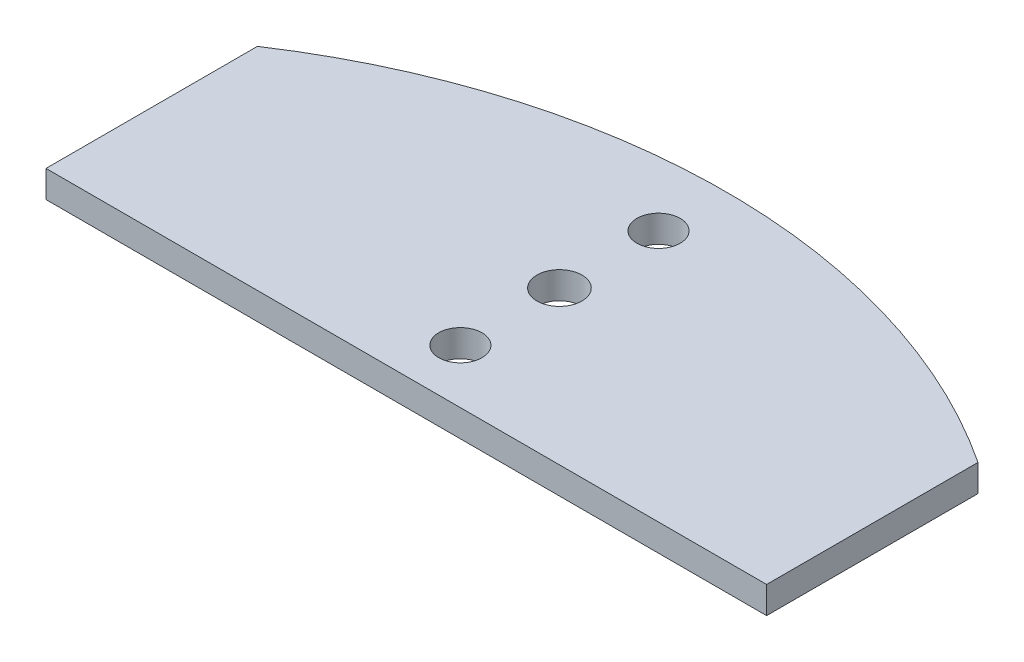
ISO-10303-21;
HEADER;
FILE_DESCRIPTION(('STEP AP214'),'2;1');
FILE_NAME('part.step','',(''),(''),'','','');
FILE_SCHEMA(('AUTOMOTIVE_DESIGN { 1 0 10303 214 1 1 1 1 }'));
ENDSEC;
DATA;
#1=APPLICATION_CONTEXT('core data for automotive mechanical design processes');
#2=APPLICATION_PROTOCOL_DEFINITION('international standard','automotive_design',2000,#1);
#3=PRODUCT_CONTEXT('',#1,'mechanical');
#4=PRODUCT('Part','Part','',(#3));
#5=PRODUCT_RELATED_PRODUCT_CATEGORY('part','',(#4));
#6=PRODUCT_DEFINITION_FORMATION('','',#4);
#7=PRODUCT_DEFINITION_CONTEXT('part definition',#1,'design');
#8=PRODUCT_DEFINITION('design','',#6,#7);
#9=PRODUCT_DEFINITION_SHAPE('','',#8);
#10=(LENGTH_UNIT() NAMED_UNIT(*) SI_UNIT(.MILLI.,.METRE.));
#11=(NAMED_UNIT(*) PLANE_ANGLE_UNIT() SI_UNIT($,.RADIAN.));
#12=(NAMED_UNIT(*) SI_UNIT($,.STERADIAN.) SOLID_ANGLE_UNIT());
#13=UNCERTAINTY_MEASURE_WITH_UNIT(LENGTH_MEASURE(1.E-05),#10,'distance_accuracy_value','');
#14=(GEOMETRIC_REPRESENTATION_CONTEXT(3) GLOBAL_UNCERTAINTY_ASSIGNED_CONTEXT((#13)) GLOBAL_UNIT_ASSIGNED_CONTEXT((#10,
#11,#12)) REPRESENTATION_CONTEXT('',''));
#15=CARTESIAN_POINT('',(0.,0.,0.));
#16=DIRECTION('',(0.,0.,1.));
#17=DIRECTION('',(1.,0.,0.));
#18=AXIS2_PLACEMENT_3D('',#15,#16,#17);
#19=CARTESIAN_POINT('',(0.,3.,0.));
#20=DIRECTION('',(0.,-1.,0.));
#21=DIRECTION('',(0.,0.,-1.));
#22=AXIS2_PLACEMENT_3D('',#19,#20,#21);
#23=CYLINDRICAL_SURFACE('',#22,72.5);
#24=DIRECTION('',(0.,-1.,0.));
#25=VECTOR('',#24,1.);
#26=CARTESIAN_POINT('',(-40.,3.,-60.4669331122391));
#27=LINE('',#26,#25);
#28=CARTESIAN_POINT('',(-40.,3.,-60.4669331122391));
#29=VERTEX_POINT('',#28);
#30=CARTESIAN_POINT('',(-40.,0.,-60.4669331122391));
#31=VERTEX_POINT('',#30);
#32=EDGE_CURVE('E100',#29,#31,#27,.T.);
#33=ORIENTED_EDGE('',*,*,#32,.F.);
#34=CARTESIAN_POINT('',(0.,3.,0.));
#35=DIRECTION('',(0.,1.,0.));
#36=DIRECTION('',(0.,0.,1.));
#37=AXIS2_PLACEMENT_3D('',#34,#35,#36);
#38=CIRCLE('',#37,72.5);
#39=CARTESIAN_POINT('',(40.,3.,-60.4669331122391));
#40=VERTEX_POINT('',#39);
#41=EDGE_CURVE('E41',#40,#29,#38,.T.);
#42=ORIENTED_EDGE('',*,*,#41,.F.);
#43=DIRECTION('',(0.,-1.,0.));
#44=VECTOR('',#43,1.);
#45=CARTESIAN_POINT('',(40.,3.,-60.4669331122391));
#46=LINE('',#45,#44);
#47=CARTESIAN_POINT('',(40.,0.,-60.4669331122391));
#48=VERTEX_POINT('',#47);
#49=EDGE_CURVE('E78',#48,#40,#46,.F.);
#50=ORIENTED_EDGE('',*,*,#49,.F.);
#51=CARTESIAN_POINT('',(0.,0.,0.));
#52=DIRECTION('',(0.,1.,0.));
#53=DIRECTION('',(0.,0.,1.));
#54=AXIS2_PLACEMENT_3D('',#51,#52,#53);
#55=CIRCLE('',#54,72.5);
#56=EDGE_CURVE('E102',#48,#31,#55,.T.);
#57=ORIENTED_EDGE('',*,*,#56,.T.);
#58=EDGE_LOOP('',(#33,#42,#50,#57));
#59=FACE_BOUND('',#58,.T.);
#60=ADVANCED_FACE('F34',(#59),#23,.T.);
#61=CARTESIAN_POINT('',(-17.0115720529893,3.,29.1490808823529));
#62=DIRECTION('',(0.,-1.,0.));
#63=DIRECTION('',(0.,0.,-1.));
#64=AXIS2_PLACEMENT_3D('',#61,#62,#63);
#65=PLANE('',#64);
#66=CARTESIAN_POINT('',(0.,3.,-54.));
#67=DIRECTION('',(0.,-1.,0.));
#68=DIRECTION('',(0.,0.,-1.));
#69=AXIS2_PLACEMENT_3D('',#66,#67,#68);
#70=CIRCLE('',#69,2.5);
#71=CARTESIAN_POINT('',(0.,3.,-56.5));
#72=VERTEX_POINT('',#71);
#73=EDGE_CURVE('E129',#72,#72,#70,.T.);
#74=ORIENTED_EDGE('',*,*,#73,.T.);
#75=EDGE_LOOP('',(#74));
#76=FACE_BOUND('',#75,.T.);
#77=CARTESIAN_POINT('',(0.,3.,-43.));
#78=DIRECTION('',(0.,-1.,0.));
#79=DIRECTION('',(0.,0.,-1.));
#80=AXIS2_PLACEMENT_3D('',#77,#78,#79);
#81=CIRCLE('',#80,2.4);
#82=CARTESIAN_POINT('',(0.,3.,-45.4));
#83=VERTEX_POINT('',#82);
#84=EDGE_CURVE('E133',#83,#83,#81,.T.);
#85=ORIENTED_EDGE('',*,*,#84,.T.);
#86=EDGE_LOOP('',(#85));
#87=FACE_BOUND('',#86,.T.);
#88=CARTESIAN_POINT('',(0.,3.,-65.));
#89=DIRECTION('',(0.,-1.,0.));
#90=DIRECTION('',(0.,0.,-1.));
#91=AXIS2_PLACEMENT_3D('',#88,#89,#90);
#92=CIRCLE('',#91,2.4);
#93=CARTESIAN_POINT('',(0.,3.,-67.4));
#94=VERTEX_POINT('',#93);
#95=EDGE_CURVE('E96',#94,#94,#92,.T.);
#96=ORIENTED_EDGE('',*,*,#95,.T.);
#97=EDGE_LOOP('',(#96));
#98=FACE_BOUND('',#97,.T.);
#99=DIRECTION('',(0.,0.,-1.));
#100=VECTOR('',#99,1.);
#101=CARTESIAN_POINT('',(-40.,3.,-37.));
#102=LINE('',#101,#100);
#103=CARTESIAN_POINT('',(-40.,3.,-37.));
#104=VERTEX_POINT('',#103);
#105=EDGE_CURVE('E56',#104,#29,#102,.T.);
#106=ORIENTED_EDGE('',*,*,#105,.F.);
#107=DIRECTION('',(-1.,0.,0.));
#108=VECTOR('',#107,1.);
#109=CARTESIAN_POINT('',(40.,3.,-37.));
#110=LINE('',#109,#108);
#111=CARTESIAN_POINT('',(40.,3.,-37.));
#112=VERTEX_POINT('',#111);
#113=EDGE_CURVE('E83',#112,#104,#110,.T.);
#114=ORIENTED_EDGE('',*,*,#113,.F.);
#115=DIRECTION('',(0.,0.,1.));
#116=VECTOR('',#115,1.);
#117=CARTESIAN_POINT('',(40.,3.,-37.));
#118=LINE('',#117,#116);
#119=EDGE_CURVE('E74',#40,#112,#118,.T.);
#120=ORIENTED_EDGE('',*,*,#119,.F.);
#121=ORIENTED_EDGE('',*,*,#41,.T.);
#122=EDGE_LOOP('',(#106,#114,#120,#121));
#123=FACE_BOUND('',#122,.T.);
#124=ADVANCED_FACE('F89',(#76,#87,#98,#123),#65,.F.);
#125=CARTESIAN_POINT('',(-17.0115720529893,0.,29.1490808823529));
#126=DIRECTION('',(0.,-1.,0.));
#127=DIRECTION('',(0.,0.,-1.));
#128=AXIS2_PLACEMENT_3D('',#125,#126,#127);
#129=PLANE('',#128);
#130=CARTESIAN_POINT('',(0.,0.,-54.));
#131=DIRECTION('',(0.,-1.,0.));
#132=DIRECTION('',(0.,0.,-1.));
#133=AXIS2_PLACEMENT_3D('',#130,#131,#132);
#134=CIRCLE('',#133,2.5);
#135=CARTESIAN_POINT('',(0.,0.,-56.5));
#136=VERTEX_POINT('',#135);
#137=EDGE_CURVE('E146',#136,#136,#134,.T.);
#138=ORIENTED_EDGE('',*,*,#137,.F.);
#139=EDGE_LOOP('',(#138));
#140=FACE_BOUND('',#139,.T.);
#141=CARTESIAN_POINT('',(0.,0.,-43.));
#142=DIRECTION('',(0.,-1.,0.));
#143=DIRECTION('',(0.,0.,-1.));
#144=AXIS2_PLACEMENT_3D('',#141,#142,#143);
#145=CIRCLE('',#144,2.4);
#146=CARTESIAN_POINT('',(0.,0.,-45.4));
#147=VERTEX_POINT('',#146);
#148=EDGE_CURVE('E142',#147,#147,#145,.T.);
#149=ORIENTED_EDGE('',*,*,#148,.F.);
#150=EDGE_LOOP('',(#149));
#151=FACE_BOUND('',#150,.T.);
#152=CARTESIAN_POINT('',(0.,0.,-65.));
#153=DIRECTION('',(0.,-1.,0.));
#154=DIRECTION('',(0.,0.,-1.));
#155=AXIS2_PLACEMENT_3D('',#152,#153,#154);
#156=CIRCLE('',#155,2.4);
#157=CARTESIAN_POINT('',(0.,0.,-67.4));
#158=VERTEX_POINT('',#157);
#159=EDGE_CURVE('E137',#158,#158,#156,.T.);
#160=ORIENTED_EDGE('',*,*,#159,.F.);
#161=EDGE_LOOP('',(#160));
#162=FACE_BOUND('',#161,.T.);
#163=DIRECTION('',(-1.,0.,0.));
#164=VECTOR('',#163,1.);
#165=CARTESIAN_POINT('',(40.,0.,-37.));
#166=LINE('',#165,#164);
#167=CARTESIAN_POINT('',(40.,0.,-37.));
#168=VERTEX_POINT('',#167);
#169=CARTESIAN_POINT('',(-40.,0.,-37.));
#170=VERTEX_POINT('',#169);
#171=EDGE_CURVE('E48',#168,#170,#166,.T.);
#172=ORIENTED_EDGE('',*,*,#171,.T.);
#173=DIRECTION('',(0.,0.,-1.));
#174=VECTOR('',#173,1.);
#175=CARTESIAN_POINT('',(-40.,0.,-37.));
#176=LINE('',#175,#174);
#177=EDGE_CURVE('E93',#170,#31,#176,.T.);
#178=ORIENTED_EDGE('',*,*,#177,.T.);
#179=ORIENTED_EDGE('',*,*,#56,.F.);
#180=DIRECTION('',(0.,0.,1.));
#181=VECTOR('',#180,1.);
#182=CARTESIAN_POINT('',(40.,0.,29.1490808823529));
#183=LINE('',#182,#181);
#184=EDGE_CURVE('E12',#48,#168,#183,.T.);
#185=ORIENTED_EDGE('',*,*,#184,.T.);
#186=EDGE_LOOP('',(#172,#178,#179,#185));
#187=FACE_BOUND('',#186,.T.);
#188=ADVANCED_FACE('F107',(#140,#151,#162,#187),#129,.T.);
#189=CARTESIAN_POINT('',(-40.,3.,-37.));
#190=DIRECTION('',(-1.,0.,0.));
#191=DIRECTION('',(0.,0.,1.));
#192=AXIS2_PLACEMENT_3D('',#189,#190,#191);
#193=PLANE('',#192);
#194=ORIENTED_EDGE('',*,*,#32,.T.);
#195=ORIENTED_EDGE('',*,*,#177,.F.);
#196=DIRECTION('',(0.,-1.,0.));
#197=VECTOR('',#196,1.);
#198=CARTESIAN_POINT('',(-40.,3.,-37.));
#199=LINE('',#198,#197);
#200=EDGE_CURVE('E87',#104,#170,#199,.T.);
#201=ORIENTED_EDGE('',*,*,#200,.F.);
#202=ORIENTED_EDGE('',*,*,#105,.T.);
#203=EDGE_LOOP('',(#194,#195,#201,#202));
#204=FACE_BOUND('',#203,.T.);
#205=ADVANCED_FACE('F109',(#204),#193,.T.);
#206=CARTESIAN_POINT('',(40.,3.,-37.));
#207=DIRECTION('',(1.,0.,0.));
#208=DIRECTION('',(0.,0.,-1.));
#209=AXIS2_PLACEMENT_3D('',#206,#207,#208);
#210=PLANE('',#209);
#211=ORIENTED_EDGE('',*,*,#49,.T.);
#212=ORIENTED_EDGE('',*,*,#119,.T.);
#213=DIRECTION('',(0.,-1.,0.));
#214=VECTOR('',#213,1.);
#215=CARTESIAN_POINT('',(40.,3.,-37.));
#216=LINE('',#215,#214);
#217=EDGE_CURVE('E76',#112,#168,#216,.T.);
#218=ORIENTED_EDGE('',*,*,#217,.T.);
#219=ORIENTED_EDGE('',*,*,#184,.F.);
#220=EDGE_LOOP('',(#211,#212,#218,#219));
#221=FACE_BOUND('',#220,.T.);
#222=ADVANCED_FACE('F75',(#221),#210,.T.);
#223=CARTESIAN_POINT('',(40.,3.,-37.));
#224=DIRECTION('',(0.,0.,1.));
#225=DIRECTION('',(1.,0.,0.));
#226=AXIS2_PLACEMENT_3D('',#223,#224,#225);
#227=PLANE('',#226);
#228=ORIENTED_EDGE('',*,*,#171,.F.);
#229=ORIENTED_EDGE('',*,*,#217,.F.);
#230=ORIENTED_EDGE('',*,*,#113,.T.);
#231=ORIENTED_EDGE('',*,*,#200,.T.);
#232=EDGE_LOOP('',(#228,#229,#230,#231));
#233=FACE_BOUND('',#232,.T.);
#234=ADVANCED_FACE('F86',(#233),#227,.T.);
#235=CARTESIAN_POINT('',(0.,3.,-65.));
#236=DIRECTION('',(0.,-1.,0.));
#237=DIRECTION('',(0.,0.,-1.));
#238=AXIS2_PLACEMENT_3D('',#235,#236,#237);
#239=CYLINDRICAL_SURFACE('',#238,2.4);
#240=ORIENTED_EDGE('',*,*,#95,.F.);
#241=EDGE_LOOP('',(#240));
#242=FACE_BOUND('',#241,.T.);
#243=ORIENTED_EDGE('',*,*,#159,.T.);
#244=EDGE_LOOP('',(#243));
#245=FACE_BOUND('',#244,.T.);
#246=ADVANCED_FACE('F157',(#242,#245),#239,.F.);
#247=CARTESIAN_POINT('',(0.,3.,-43.));
#248=DIRECTION('',(0.,-1.,0.));
#249=DIRECTION('',(0.,0.,-1.));
#250=AXIS2_PLACEMENT_3D('',#247,#248,#249);
#251=CYLINDRICAL_SURFACE('',#250,2.4);
#252=ORIENTED_EDGE('',*,*,#84,.F.);
#253=EDGE_LOOP('',(#252));
#254=FACE_BOUND('',#253,.T.);
#255=ORIENTED_EDGE('',*,*,#148,.T.);
#256=EDGE_LOOP('',(#255));
#257=FACE_BOUND('',#256,.T.);
#258=ADVANCED_FACE('F159',(#254,#257),#251,.F.);
#259=CARTESIAN_POINT('',(0.,3.,-54.));
#260=DIRECTION('',(0.,-1.,0.));
#261=DIRECTION('',(0.,0.,-1.));
#262=AXIS2_PLACEMENT_3D('',#259,#260,#261);
#263=CYLINDRICAL_SURFACE('',#262,2.5);
#264=ORIENTED_EDGE('',*,*,#73,.F.);
#265=EDGE_LOOP('',(#264));
#266=FACE_BOUND('',#265,.T.);
#267=ORIENTED_EDGE('',*,*,#137,.T.);
#268=EDGE_LOOP('',(#267));
#269=FACE_BOUND('',#268,.T.);
#270=ADVANCED_FACE('F151',(#266,#269),#263,.F.);
#271=CLOSED_SHELL('',(#60,#124,#188,#205,#222,#234,#246,#258,#270));
#272=MANIFOLD_SOLID_BREP('B2',#271);
#273=ADVANCED_BREP_SHAPE_REPRESENTATION('',(#18,#272),#14);
#274=SHAPE_DEFINITION_REPRESENTATION(#9,#273);
ENDSEC;
END-ISO-10303-21;
